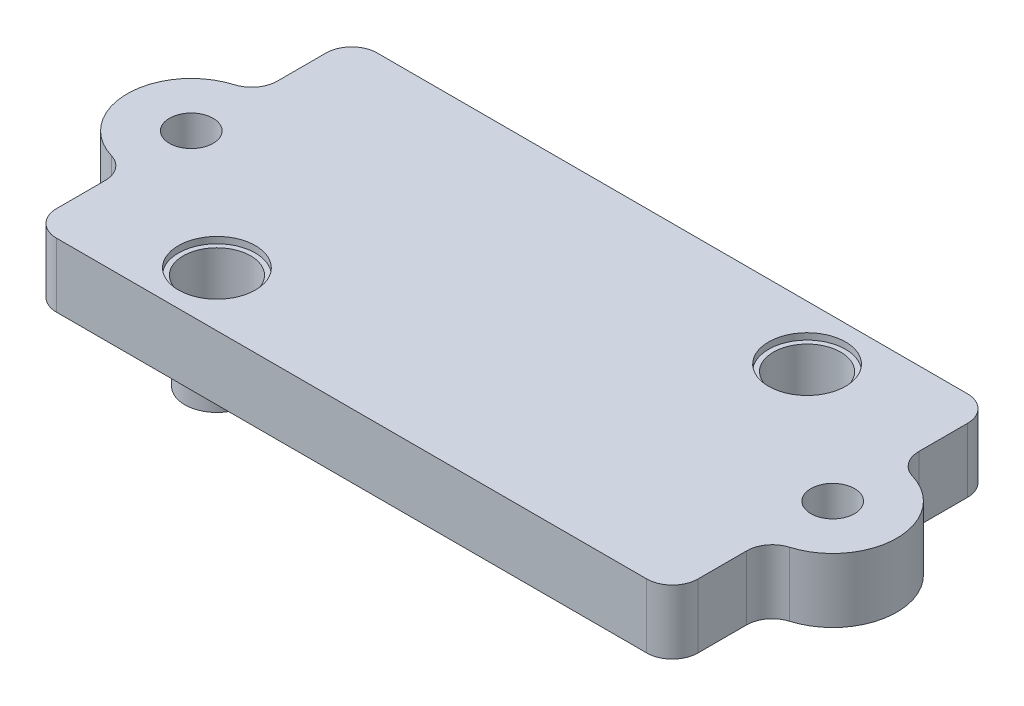
ISO-10303-21;
HEADER;
FILE_DESCRIPTION(('STEP AP214'),'2;1');
FILE_NAME('part.step','',(''),(''),'','','');
FILE_SCHEMA(('AUTOMOTIVE_DESIGN { 1 0 10303 214 1 1 1 1 }'));
ENDSEC;
DATA;
#1=APPLICATION_CONTEXT('core data for automotive mechanical design processes');
#2=APPLICATION_PROTOCOL_DEFINITION('international standard','automotive_design',2000,#1);
#3=PRODUCT_CONTEXT('',#1,'mechanical');
#4=PRODUCT('Part','Part','',(#3));
#5=PRODUCT_RELATED_PRODUCT_CATEGORY('part','',(#4));
#6=PRODUCT_DEFINITION_FORMATION('','',#4);
#7=PRODUCT_DEFINITION_CONTEXT('part definition',#1,'design');
#8=PRODUCT_DEFINITION('design','',#6,#7);
#9=PRODUCT_DEFINITION_SHAPE('','',#8);
#10=(LENGTH_UNIT() NAMED_UNIT(*) SI_UNIT(.MILLI.,.METRE.));
#11=(NAMED_UNIT(*) PLANE_ANGLE_UNIT() SI_UNIT($,.RADIAN.));
#12=(NAMED_UNIT(*) SI_UNIT($,.STERADIAN.) SOLID_ANGLE_UNIT());
#13=UNCERTAINTY_MEASURE_WITH_UNIT(LENGTH_MEASURE(1.E-05),#10,'distance_accuracy_value','');
#14=(GEOMETRIC_REPRESENTATION_CONTEXT(3) GLOBAL_UNCERTAINTY_ASSIGNED_CONTEXT((#13)) GLOBAL_UNIT_ASSIGNED_CONTEXT((#10,
#11,#12)) REPRESENTATION_CONTEXT('',''));
#15=CARTESIAN_POINT('',(0.,0.,0.));
#16=DIRECTION('',(0.,0.,1.));
#17=DIRECTION('',(1.,0.,0.));
#18=AXIS2_PLACEMENT_3D('',#15,#16,#17);
#19=CARTESIAN_POINT('',(0.,0.,0.));
#20=DIRECTION('',(0.,1.,0.));
#21=DIRECTION('',(0.,0.,1.));
#22=AXIS2_PLACEMENT_3D('',#19,#20,#21);
#23=PLANE('',#22);
#24=CARTESIAN_POINT('',(25.,0.,0.));
#25=DIRECTION('',(0.,-1.,0.));
#26=DIRECTION('',(0.,0.,-1.));
#27=AXIS2_PLACEMENT_3D('',#24,#25,#26);
#28=CIRCLE('',#27,3.15);
#29=CARTESIAN_POINT('',(25.,0.,-3.15));
#30=VERTEX_POINT('',#29);
#31=EDGE_CURVE('E303',#30,#30,#28,.T.);
#32=ORIENTED_EDGE('',*,*,#31,.F.);
#33=EDGE_LOOP('',(#32));
#34=FACE_BOUND('',#33,.T.);
#35=CARTESIAN_POINT('',(14.75,0.,-8.25));
#36=DIRECTION('',(0.,1.,0.));
#37=DIRECTION('',(0.,0.,1.));
#38=AXIS2_PLACEMENT_3D('',#35,#36,#37);
#39=CIRCLE('',#38,2.5);
#40=CARTESIAN_POINT('',(14.75,0.,-5.75000000000001));
#41=VERTEX_POINT('',#40);
#42=EDGE_CURVE('E12',#41,#41,#39,.F.);
#43=ORIENTED_EDGE('',*,*,#42,.F.);
#44=EDGE_LOOP('',(#43));
#45=FACE_BOUND('',#44,.T.);
#46=CARTESIAN_POINT('',(-14.75,0.,8.25));
#47=DIRECTION('',(0.,1.,0.));
#48=DIRECTION('',(0.,0.,1.));
#49=AXIS2_PLACEMENT_3D('',#46,#47,#48);
#50=CIRCLE('',#49,2.5);
#51=CARTESIAN_POINT('',(-14.75,0.,10.75));
#52=VERTEX_POINT('',#51);
#53=EDGE_CURVE('E77',#52,#52,#50,.F.);
#54=ORIENTED_EDGE('',*,*,#53,.F.);
#55=EDGE_LOOP('',(#54));
#56=FACE_BOUND('',#55,.T.);
#57=DIRECTION('',(0.,0.,1.));
#58=VECTOR('',#57,1.);
#59=CARTESIAN_POINT('',(25.,0.,0.));
#60=LINE('',#59,#58);
#61=CARTESIAN_POINT('',(25.,0.,6.70820393249937));
#62=VERTEX_POINT('',#61);
#63=CARTESIAN_POINT('',(25.,0.,10.5));
#64=VERTEX_POINT('',#63);
#65=EDGE_CURVE('E188',#62,#64,#60,.T.);
#66=ORIENTED_EDGE('',*,*,#65,.T.);
#67=CARTESIAN_POINT('',(23.,0.,10.5));
#68=DIRECTION('',(0.,1.,0.));
#69=DIRECTION('',(0.,0.,1.));
#70=AXIS2_PLACEMENT_3D('',#67,#68,#69);
#71=CIRCLE('',#70,2.);
#72=CARTESIAN_POINT('',(23.,0.,12.5));
#73=VERTEX_POINT('',#72);
#74=EDGE_CURVE('E226',#64,#73,#71,.F.);
#75=ORIENTED_EDGE('',*,*,#74,.T.);
#76=DIRECTION('',(1.,0.,0.));
#77=VECTOR('',#76,1.);
#78=CARTESIAN_POINT('',(0.,0.,12.5));
#79=LINE('',#78,#77);
#80=CARTESIAN_POINT('',(-23.,0.,12.5));
#81=VERTEX_POINT('',#80);
#82=EDGE_CURVE('E218',#81,#73,#79,.T.);
#83=ORIENTED_EDGE('',*,*,#82,.F.);
#84=CARTESIAN_POINT('',(-23.,0.,10.5));
#85=DIRECTION('',(0.,1.,0.));
#86=DIRECTION('',(0.,0.,1.));
#87=AXIS2_PLACEMENT_3D('',#84,#85,#86);
#88=CIRCLE('',#87,2.);
#89=CARTESIAN_POINT('',(-25.,0.,10.5));
#90=VERTEX_POINT('',#89);
#91=EDGE_CURVE('E224',#81,#90,#88,.F.);
#92=ORIENTED_EDGE('',*,*,#91,.T.);
#93=DIRECTION('',(0.,0.,1.));
#94=VECTOR('',#93,1.);
#95=CARTESIAN_POINT('',(-25.,0.,0.));
#96=LINE('',#95,#94);
#97=CARTESIAN_POINT('',(-25.,0.,6.70820393249938));
#98=VERTEX_POINT('',#97);
#99=EDGE_CURVE('E370',#98,#90,#96,.T.);
#100=ORIENTED_EDGE('',*,*,#99,.F.);
#101=CARTESIAN_POINT('',(-27.,0.,6.70820393249938));
#102=DIRECTION('',(0.,1.,0.));
#103=DIRECTION('',(0.,0.,1.));
#104=AXIS2_PLACEMENT_3D('',#101,#102,#103);
#105=CIRCLE('',#104,2.);
#106=CARTESIAN_POINT('',(-26.4285714285714,0.,4.79157423749956));
#107=VERTEX_POINT('',#106);
#108=EDGE_CURVE('E277',#98,#107,#105,.T.);
#109=ORIENTED_EDGE('',*,*,#108,.T.);
#110=CARTESIAN_POINT('',(-25.,0.,0.));
#111=DIRECTION('',(0.,1.,0.));
#112=DIRECTION('',(0.,0.,1.));
#113=AXIS2_PLACEMENT_3D('',#110,#111,#112);
#114=CIRCLE('',#113,5.);
#115=CARTESIAN_POINT('',(-26.4285714285714,0.,-4.79157423749954));
#116=VERTEX_POINT('',#115);
#117=EDGE_CURVE('E368',#116,#107,#114,.T.);
#118=ORIENTED_EDGE('',*,*,#117,.F.);
#119=CARTESIAN_POINT('',(-27.,0.,-6.70820393249936));
#120=DIRECTION('',(0.,1.,0.));
#121=DIRECTION('',(0.,0.,1.));
#122=AXIS2_PLACEMENT_3D('',#119,#120,#121);
#123=CIRCLE('',#122,2.);
#124=CARTESIAN_POINT('',(-25.,0.,-6.70820393249936));
#125=VERTEX_POINT('',#124);
#126=EDGE_CURVE('E269',#116,#125,#123,.T.);
#127=ORIENTED_EDGE('',*,*,#126,.T.);
#128=DIRECTION('',(0.,0.,1.));
#129=VECTOR('',#128,1.);
#130=CARTESIAN_POINT('',(-25.,0.,0.));
#131=LINE('',#130,#129);
#132=CARTESIAN_POINT('',(-25.,0.,-10.5));
#133=VERTEX_POINT('',#132);
#134=EDGE_CURVE('E365',#133,#125,#131,.T.);
#135=ORIENTED_EDGE('',*,*,#134,.F.);
#136=CARTESIAN_POINT('',(-23.,0.,-10.5));
#137=DIRECTION('',(0.,1.,0.));
#138=DIRECTION('',(0.,0.,1.));
#139=AXIS2_PLACEMENT_3D('',#136,#137,#138);
#140=CIRCLE('',#139,2.);
#141=CARTESIAN_POINT('',(-23.,0.,-12.5));
#142=VERTEX_POINT('',#141);
#143=EDGE_CURVE('E222',#133,#142,#140,.F.);
#144=ORIENTED_EDGE('',*,*,#143,.T.);
#145=DIRECTION('',(1.,0.,0.));
#146=VECTOR('',#145,1.);
#147=CARTESIAN_POINT('',(0.,0.,-12.5));
#148=LINE('',#147,#146);
#149=CARTESIAN_POINT('',(23.,0.,-12.5));
#150=VERTEX_POINT('',#149);
#151=EDGE_CURVE('E362',#142,#150,#148,.T.);
#152=ORIENTED_EDGE('',*,*,#151,.T.);
#153=CARTESIAN_POINT('',(23.,0.,-10.5));
#154=DIRECTION('',(0.,1.,0.));
#155=DIRECTION('',(0.,0.,1.));
#156=AXIS2_PLACEMENT_3D('',#153,#154,#155);
#157=CIRCLE('',#156,2.);
#158=CARTESIAN_POINT('',(25.,0.,-10.5));
#159=VERTEX_POINT('',#158);
#160=EDGE_CURVE('E212',#150,#159,#157,.F.);
#161=ORIENTED_EDGE('',*,*,#160,.T.);
#162=DIRECTION('',(0.,0.,1.));
#163=VECTOR('',#162,1.);
#164=CARTESIAN_POINT('',(25.,0.,0.));
#165=LINE('',#164,#163);
#166=CARTESIAN_POINT('',(25.,0.,-6.70820393249937));
#167=VERTEX_POINT('',#166);
#168=EDGE_CURVE('E359',#159,#167,#165,.T.);
#169=ORIENTED_EDGE('',*,*,#168,.T.);
#170=CARTESIAN_POINT('',(27.,0.,-6.70820393249937));
#171=DIRECTION('',(0.,1.,0.));
#172=DIRECTION('',(0.,0.,1.));
#173=AXIS2_PLACEMENT_3D('',#170,#171,#172);
#174=CIRCLE('',#173,2.);
#175=CARTESIAN_POINT('',(26.4285714285714,0.,-4.79157423749955));
#176=VERTEX_POINT('',#175);
#177=EDGE_CURVE('E273',#167,#176,#174,.T.);
#178=ORIENTED_EDGE('',*,*,#177,.T.);
#179=CARTESIAN_POINT('',(25.,0.,0.));
#180=DIRECTION('',(0.,1.,0.));
#181=DIRECTION('',(0.,0.,1.));
#182=AXIS2_PLACEMENT_3D('',#179,#180,#181);
#183=CIRCLE('',#182,5.);
#184=CARTESIAN_POINT('',(26.4285714285714,0.,4.79157423749955));
#185=VERTEX_POINT('',#184);
#186=EDGE_CURVE('E190',#185,#176,#183,.T.);
#187=ORIENTED_EDGE('',*,*,#186,.F.);
#188=CARTESIAN_POINT('',(27.,0.,6.70820393249937));
#189=DIRECTION('',(0.,1.,0.));
#190=DIRECTION('',(0.,0.,1.));
#191=AXIS2_PLACEMENT_3D('',#188,#189,#190);
#192=CIRCLE('',#191,2.);
#193=EDGE_CURVE('E185',#185,#62,#192,.T.);
#194=ORIENTED_EDGE('',*,*,#193,.T.);
#195=EDGE_LOOP('',(#66,#75,#83,#92,#100,#109,#118,#127,#135,#144,#152,#161,#169,#178,#187,#194));
#196=FACE_BOUND('',#195,.T.);
#197=CARTESIAN_POINT('',(-25.,0.,0.));
#198=DIRECTION('',(0.,-1.,0.));
#199=DIRECTION('',(0.,0.,-1.));
#200=AXIS2_PLACEMENT_3D('',#197,#198,#199);
#201=CIRCLE('',#200,3.15);
#202=CARTESIAN_POINT('',(-25.,0.,-3.14999999999999));
#203=VERTEX_POINT('',#202);
#204=EDGE_CURVE('E283',#203,#203,#201,.T.);
#205=ORIENTED_EDGE('',*,*,#204,.F.);
#206=EDGE_LOOP('',(#205));
#207=FACE_BOUND('',#206,.T.);
#208=ADVANCED_FACE('F68',(#34,#45,#56,#196,#207),#23,.F.);
#209=CARTESIAN_POINT('',(0.,5.,0.));
#210=DIRECTION('',(0.,1.,0.));
#211=DIRECTION('',(0.,0.,1.));
#212=AXIS2_PLACEMENT_3D('',#209,#210,#211);
#213=PLANE('',#212);
#214=CARTESIAN_POINT('',(-25.,5.,0.));
#215=DIRECTION('',(0.,-1.,0.));
#216=DIRECTION('',(0.,0.,-1.));
#217=AXIS2_PLACEMENT_3D('',#214,#215,#216);
#218=CIRCLE('',#217,1.7);
#219=CARTESIAN_POINT('',(-25.,5.,-1.69999999999999));
#220=VERTEX_POINT('',#219);
#221=EDGE_CURVE('E300',#220,#220,#218,.T.);
#222=ORIENTED_EDGE('',*,*,#221,.T.);
#223=EDGE_LOOP('',(#222));
#224=FACE_BOUND('',#223,.T.);
#225=CARTESIAN_POINT('',(25.,5.,0.));
#226=DIRECTION('',(0.,-1.,0.));
#227=DIRECTION('',(0.,0.,-1.));
#228=AXIS2_PLACEMENT_3D('',#225,#226,#227);
#229=CIRCLE('',#228,1.7);
#230=CARTESIAN_POINT('',(25.,5.,-1.7));
#231=VERTEX_POINT('',#230);
#232=EDGE_CURVE('E309',#231,#231,#229,.T.);
#233=ORIENTED_EDGE('',*,*,#232,.T.);
#234=EDGE_LOOP('',(#233));
#235=FACE_BOUND('',#234,.T.);
#236=CARTESIAN_POINT('',(-14.75,5.,8.25));
#237=DIRECTION('',(0.,1.,0.));
#238=DIRECTION('',(0.,0.,1.));
#239=AXIS2_PLACEMENT_3D('',#236,#237,#238);
#240=CIRCLE('',#239,3.);
#241=CARTESIAN_POINT('',(-14.75,5.,11.25));
#242=VERTEX_POINT('',#241);
#243=EDGE_CURVE('E312',#242,#242,#240,.T.);
#244=ORIENTED_EDGE('',*,*,#243,.F.);
#245=EDGE_LOOP('',(#244));
#246=FACE_BOUND('',#245,.T.);
#247=CARTESIAN_POINT('',(14.75,5.,-8.25));
#248=DIRECTION('',(0.,1.,0.));
#249=DIRECTION('',(0.,0.,1.));
#250=AXIS2_PLACEMENT_3D('',#247,#248,#249);
#251=CIRCLE('',#250,3.);
#252=CARTESIAN_POINT('',(14.75,5.,-5.25000000000001));
#253=VERTEX_POINT('',#252);
#254=EDGE_CURVE('E324',#253,#253,#251,.T.);
#255=ORIENTED_EDGE('',*,*,#254,.F.);
#256=EDGE_LOOP('',(#255));
#257=FACE_BOUND('',#256,.T.);
#258=DIRECTION('',(1.,0.,0.));
#259=VECTOR('',#258,1.);
#260=CARTESIAN_POINT('',(0.,5.,12.5));
#261=LINE('',#260,#259);
#262=CARTESIAN_POINT('',(-23.,5.,12.5));
#263=VERTEX_POINT('',#262);
#264=CARTESIAN_POINT('',(23.,5.,12.5));
#265=VERTEX_POINT('',#264);
#266=EDGE_CURVE('E210',#263,#265,#261,.T.);
#267=ORIENTED_EDGE('',*,*,#266,.T.);
#268=CARTESIAN_POINT('',(23.,5.,10.5));
#269=DIRECTION('',(0.,1.,0.));
#270=DIRECTION('',(0.,0.,1.));
#271=AXIS2_PLACEMENT_3D('',#268,#269,#270);
#272=CIRCLE('',#271,2.);
#273=CARTESIAN_POINT('',(25.,5.,10.5));
#274=VERTEX_POINT('',#273);
#275=EDGE_CURVE('E239',#265,#274,#272,.T.);
#276=ORIENTED_EDGE('',*,*,#275,.T.);
#277=DIRECTION('',(0.,0.,1.));
#278=VECTOR('',#277,1.);
#279=CARTESIAN_POINT('',(25.,5.,0.));
#280=LINE('',#279,#278);
#281=CARTESIAN_POINT('',(25.,5.,6.70820393249937));
#282=VERTEX_POINT('',#281);
#283=EDGE_CURVE('E341',#282,#274,#280,.T.);
#284=ORIENTED_EDGE('',*,*,#283,.F.);
#285=CARTESIAN_POINT('',(27.,5.,6.70820393249937));
#286=DIRECTION('',(0.,1.,0.));
#287=DIRECTION('',(0.,0.,1.));
#288=AXIS2_PLACEMENT_3D('',#285,#286,#287);
#289=CIRCLE('',#288,2.);
#290=CARTESIAN_POINT('',(26.4285714285714,5.,4.79157423749955));
#291=VERTEX_POINT('',#290);
#292=EDGE_CURVE('E195',#282,#291,#289,.F.);
#293=ORIENTED_EDGE('',*,*,#292,.T.);
#294=CARTESIAN_POINT('',(25.,5.,0.));
#295=DIRECTION('',(0.,1.,0.));
#296=DIRECTION('',(0.,0.,1.));
#297=AXIS2_PLACEMENT_3D('',#294,#295,#296);
#298=CIRCLE('',#297,5.);
#299=CARTESIAN_POINT('',(26.4285714285714,5.,-4.79157423749955));
#300=VERTEX_POINT('',#299);
#301=EDGE_CURVE('E343',#291,#300,#298,.T.);
#302=ORIENTED_EDGE('',*,*,#301,.T.);
#303=CARTESIAN_POINT('',(27.,5.,-6.70820393249937));
#304=DIRECTION('',(0.,1.,0.));
#305=DIRECTION('',(0.,0.,1.));
#306=AXIS2_PLACEMENT_3D('',#303,#304,#305);
#307=CIRCLE('',#306,2.);
#308=CARTESIAN_POINT('',(25.,5.,-6.70820393249937));
#309=VERTEX_POINT('',#308);
#310=EDGE_CURVE('E196',#300,#309,#307,.F.);
#311=ORIENTED_EDGE('',*,*,#310,.T.);
#312=DIRECTION('',(0.,0.,1.));
#313=VECTOR('',#312,1.);
#314=CARTESIAN_POINT('',(25.,5.,0.));
#315=LINE('',#314,#313);
#316=CARTESIAN_POINT('',(25.,5.,-10.5));
#317=VERTEX_POINT('',#316);
#318=EDGE_CURVE('E346',#317,#309,#315,.T.);
#319=ORIENTED_EDGE('',*,*,#318,.F.);
#320=CARTESIAN_POINT('',(23.,5.,-10.5));
#321=DIRECTION('',(0.,1.,0.));
#322=DIRECTION('',(0.,0.,1.));
#323=AXIS2_PLACEMENT_3D('',#320,#321,#322);
#324=CIRCLE('',#323,2.);
#325=CARTESIAN_POINT('',(23.,5.,-12.5));
#326=VERTEX_POINT('',#325);
#327=EDGE_CURVE('E233',#317,#326,#324,.T.);
#328=ORIENTED_EDGE('',*,*,#327,.T.);
#329=DIRECTION('',(1.,0.,0.));
#330=VECTOR('',#329,1.);
#331=CARTESIAN_POINT('',(0.,5.,-12.5));
#332=LINE('',#331,#330);
#333=CARTESIAN_POINT('',(-23.,5.,-12.5));
#334=VERTEX_POINT('',#333);
#335=EDGE_CURVE('E349',#334,#326,#332,.T.);
#336=ORIENTED_EDGE('',*,*,#335,.F.);
#337=CARTESIAN_POINT('',(-23.,5.,-10.5));
#338=DIRECTION('',(0.,1.,0.));
#339=DIRECTION('',(0.,0.,1.));
#340=AXIS2_PLACEMENT_3D('',#337,#338,#339);
#341=CIRCLE('',#340,2.);
#342=CARTESIAN_POINT('',(-25.,5.,-10.5));
#343=VERTEX_POINT('',#342);
#344=EDGE_CURVE('E235',#334,#343,#341,.T.);
#345=ORIENTED_EDGE('',*,*,#344,.T.);
#346=DIRECTION('',(0.,0.,1.));
#347=VECTOR('',#346,1.);
#348=CARTESIAN_POINT('',(-25.,5.,0.));
#349=LINE('',#348,#347);
#350=CARTESIAN_POINT('',(-25.,5.,-6.70820393249936));
#351=VERTEX_POINT('',#350);
#352=EDGE_CURVE('E352',#343,#351,#349,.T.);
#353=ORIENTED_EDGE('',*,*,#352,.T.);
#354=CARTESIAN_POINT('',(-27.,5.,-6.70820393249936));
#355=DIRECTION('',(0.,1.,0.));
#356=DIRECTION('',(0.,0.,1.));
#357=AXIS2_PLACEMENT_3D('',#354,#355,#356);
#358=CIRCLE('',#357,2.);
#359=CARTESIAN_POINT('',(-26.4285714285714,5.,-4.79157423749954));
#360=VERTEX_POINT('',#359);
#361=EDGE_CURVE('E271',#351,#360,#358,.F.);
#362=ORIENTED_EDGE('',*,*,#361,.T.);
#363=CARTESIAN_POINT('',(-25.,5.,0.));
#364=DIRECTION('',(0.,1.,0.));
#365=DIRECTION('',(0.,0.,1.));
#366=AXIS2_PLACEMENT_3D('',#363,#364,#365);
#367=CIRCLE('',#366,5.);
#368=CARTESIAN_POINT('',(-26.4285714285714,5.,4.79157423749956));
#369=VERTEX_POINT('',#368);
#370=EDGE_CURVE('E355',#360,#369,#367,.T.);
#371=ORIENTED_EDGE('',*,*,#370,.T.);
#372=CARTESIAN_POINT('',(-27.,5.,6.70820393249938));
#373=DIRECTION('',(0.,1.,0.));
#374=DIRECTION('',(0.,0.,1.));
#375=AXIS2_PLACEMENT_3D('',#372,#373,#374);
#376=CIRCLE('',#375,2.);
#377=CARTESIAN_POINT('',(-25.,5.,6.70820393249938));
#378=VERTEX_POINT('',#377);
#379=EDGE_CURVE('E92',#369,#378,#376,.F.);
#380=ORIENTED_EDGE('',*,*,#379,.T.);
#381=DIRECTION('',(0.,0.,1.));
#382=VECTOR('',#381,1.);
#383=CARTESIAN_POINT('',(-25.,5.,0.));
#384=LINE('',#383,#382);
#385=CARTESIAN_POINT('',(-25.,5.,10.5));
#386=VERTEX_POINT('',#385);
#387=EDGE_CURVE('E215',#378,#386,#384,.T.);
#388=ORIENTED_EDGE('',*,*,#387,.T.);
#389=CARTESIAN_POINT('',(-23.,5.,10.5));
#390=DIRECTION('',(0.,1.,0.));
#391=DIRECTION('',(0.,0.,1.));
#392=AXIS2_PLACEMENT_3D('',#389,#390,#391);
#393=CIRCLE('',#392,2.);
#394=EDGE_CURVE('E237',#386,#263,#393,.T.);
#395=ORIENTED_EDGE('',*,*,#394,.T.);
#396=EDGE_LOOP('',(#267,#276,#284,#293,#302,#311,#319,#328,#336,#345,#353,#362,#371,#380,#388,#395));
#397=FACE_BOUND('',#396,.T.);
#398=ADVANCED_FACE('F382',(#224,#235,#246,#257,#397),#213,.T.);
#399=CARTESIAN_POINT('',(25.,5.,0.));
#400=DIRECTION('',(0.,-1.,0.));
#401=DIRECTION('',(0.,0.,-1.));
#402=AXIS2_PLACEMENT_3D('',#399,#400,#401);
#403=CYLINDRICAL_SURFACE('',#402,5.);
#404=ORIENTED_EDGE('',*,*,#186,.T.);
#405=DIRECTION('',(0.,-1.,0.));
#406=VECTOR('',#405,1.);
#407=CARTESIAN_POINT('',(26.4285714285714,5.,-4.79157423749955));
#408=LINE('',#407,#406);
#409=EDGE_CURVE('E267',#176,#300,#408,.F.);
#410=ORIENTED_EDGE('',*,*,#409,.T.);
#411=ORIENTED_EDGE('',*,*,#301,.F.);
#412=DIRECTION('',(0.,-1.,0.));
#413=VECTOR('',#412,1.);
#414=CARTESIAN_POINT('',(26.4285714285714,5.,4.79157423749955));
#415=LINE('',#414,#413);
#416=EDGE_CURVE('E265',#291,#185,#415,.T.);
#417=ORIENTED_EDGE('',*,*,#416,.T.);
#418=EDGE_LOOP('',(#404,#410,#411,#417));
#419=FACE_BOUND('',#418,.T.);
#420=ADVANCED_FACE('F407',(#419),#403,.T.);
#421=CARTESIAN_POINT('',(25.,5.,0.));
#422=DIRECTION('',(1.,0.,0.));
#423=DIRECTION('',(0.,0.,-1.));
#424=AXIS2_PLACEMENT_3D('',#421,#422,#423);
#425=PLANE('',#424);
#426=ORIENTED_EDGE('',*,*,#168,.F.);
#427=DIRECTION('',(0.,-1.,0.));
#428=VECTOR('',#427,1.);
#429=CARTESIAN_POINT('',(25.,5.,-10.5));
#430=LINE('',#429,#428);
#431=EDGE_CURVE('E263',#159,#317,#430,.F.);
#432=ORIENTED_EDGE('',*,*,#431,.T.);
#433=ORIENTED_EDGE('',*,*,#318,.T.);
#434=DIRECTION('',(0.,-1.,0.));
#435=VECTOR('',#434,1.);
#436=CARTESIAN_POINT('',(25.,5.,-6.70820393249937));
#437=LINE('',#436,#435);
#438=EDGE_CURVE('E260',#309,#167,#437,.T.);
#439=ORIENTED_EDGE('',*,*,#438,.T.);
#440=EDGE_LOOP('',(#426,#432,#433,#439));
#441=FACE_BOUND('',#440,.T.);
#442=ADVANCED_FACE('F417',(#441),#425,.T.);
#443=CARTESIAN_POINT('',(0.,5.,-12.5));
#444=DIRECTION('',(0.,0.,-1.));
#445=DIRECTION('',(-1.,0.,0.));
#446=AXIS2_PLACEMENT_3D('',#443,#444,#445);
#447=PLANE('',#446);
#448=ORIENTED_EDGE('',*,*,#151,.F.);
#449=DIRECTION('',(0.,-1.,0.));
#450=VECTOR('',#449,1.);
#451=CARTESIAN_POINT('',(-23.,5.,-12.5));
#452=LINE('',#451,#450);
#453=EDGE_CURVE('E258',#142,#334,#452,.F.);
#454=ORIENTED_EDGE('',*,*,#453,.T.);
#455=ORIENTED_EDGE('',*,*,#335,.T.);
#456=DIRECTION('',(0.,-1.,0.));
#457=VECTOR('',#456,1.);
#458=CARTESIAN_POINT('',(23.,5.,-12.5));
#459=LINE('',#458,#457);
#460=EDGE_CURVE('E255',#326,#150,#459,.T.);
#461=ORIENTED_EDGE('',*,*,#460,.T.);
#462=EDGE_LOOP('',(#448,#454,#455,#461));
#463=FACE_BOUND('',#462,.T.);
#464=ADVANCED_FACE('F423',(#463),#447,.T.);
#465=CARTESIAN_POINT('',(-25.,5.,0.));
#466=DIRECTION('',(1.,0.,0.));
#467=DIRECTION('',(0.,0.,-1.));
#468=AXIS2_PLACEMENT_3D('',#465,#466,#467);
#469=PLANE('',#468);
#470=ORIENTED_EDGE('',*,*,#134,.T.);
#471=DIRECTION('',(0.,1.,0.));
#472=VECTOR('',#471,1.);
#473=CARTESIAN_POINT('',(-25.,5.,-6.70820393249936));
#474=LINE('',#473,#472);
#475=EDGE_CURVE('E253',#125,#351,#474,.T.);
#476=ORIENTED_EDGE('',*,*,#475,.T.);
#477=ORIENTED_EDGE('',*,*,#352,.F.);
#478=DIRECTION('',(0.,-1.,0.));
#479=VECTOR('',#478,1.);
#480=CARTESIAN_POINT('',(-25.,0.,-10.5));
#481=LINE('',#480,#479);
#482=EDGE_CURVE('E250',#343,#133,#481,.T.);
#483=ORIENTED_EDGE('',*,*,#482,.T.);
#484=EDGE_LOOP('',(#470,#476,#477,#483));
#485=FACE_BOUND('',#484,.T.);
#486=ADVANCED_FACE('F402',(#485),#469,.F.);
#487=CARTESIAN_POINT('',(-25.,5.,0.));
#488=DIRECTION('',(0.,-1.,0.));
#489=DIRECTION('',(0.,0.,-1.));
#490=AXIS2_PLACEMENT_3D('',#487,#488,#489);
#491=CYLINDRICAL_SURFACE('',#490,5.);
#492=ORIENTED_EDGE('',*,*,#370,.F.);
#493=DIRECTION('',(0.,-1.,0.));
#494=VECTOR('',#493,1.);
#495=CARTESIAN_POINT('',(-26.4285714285714,5.,-4.79157423749954));
#496=LINE('',#495,#494);
#497=EDGE_CURVE('E247',#360,#116,#496,.T.);
#498=ORIENTED_EDGE('',*,*,#497,.T.);
#499=ORIENTED_EDGE('',*,*,#117,.T.);
#500=DIRECTION('',(0.,-1.,0.));
#501=VECTOR('',#500,1.);
#502=CARTESIAN_POINT('',(-26.4285714285714,5.,4.79157423749956));
#503=LINE('',#502,#501);
#504=EDGE_CURVE('E245',#107,#369,#503,.F.);
#505=ORIENTED_EDGE('',*,*,#504,.T.);
#506=EDGE_LOOP('',(#492,#498,#499,#505));
#507=FACE_BOUND('',#506,.T.);
#508=ADVANCED_FACE('F392',(#507),#491,.T.);
#509=CARTESIAN_POINT('',(-25.,5.,0.));
#510=DIRECTION('',(1.,0.,0.));
#511=DIRECTION('',(0.,0.,-1.));
#512=AXIS2_PLACEMENT_3D('',#509,#510,#511);
#513=PLANE('',#512);
#514=ORIENTED_EDGE('',*,*,#99,.T.);
#515=DIRECTION('',(0.,-1.,0.));
#516=VECTOR('',#515,1.);
#517=CARTESIAN_POINT('',(-25.,5.,10.5));
#518=LINE('',#517,#516);
#519=EDGE_CURVE('E85',#90,#386,#518,.F.);
#520=ORIENTED_EDGE('',*,*,#519,.T.);
#521=ORIENTED_EDGE('',*,*,#387,.F.);
#522=DIRECTION('',(0.,1.,0.));
#523=VECTOR('',#522,1.);
#524=CARTESIAN_POINT('',(-25.,0.,6.70820393249938));
#525=LINE('',#524,#523);
#526=EDGE_CURVE('E241',#378,#98,#525,.F.);
#527=ORIENTED_EDGE('',*,*,#526,.T.);
#528=EDGE_LOOP('',(#514,#520,#521,#527));
#529=FACE_BOUND('',#528,.T.);
#530=ADVANCED_FACE('F394',(#529),#513,.F.);
#531=CARTESIAN_POINT('',(0.,5.,12.5));
#532=DIRECTION('',(0.,0.,-1.));
#533=DIRECTION('',(-1.,0.,0.));
#534=AXIS2_PLACEMENT_3D('',#531,#532,#533);
#535=PLANE('',#534);
#536=ORIENTED_EDGE('',*,*,#82,.T.);
#537=DIRECTION('',(0.,-1.,0.));
#538=VECTOR('',#537,1.);
#539=CARTESIAN_POINT('',(23.,5.,12.5));
#540=LINE('',#539,#538);
#541=EDGE_CURVE('E231',#73,#265,#540,.F.);
#542=ORIENTED_EDGE('',*,*,#541,.T.);
#543=ORIENTED_EDGE('',*,*,#266,.F.);
#544=DIRECTION('',(0.,-1.,0.));
#545=VECTOR('',#544,1.);
#546=CARTESIAN_POINT('',(-23.,5.,12.5));
#547=LINE('',#546,#545);
#548=EDGE_CURVE('E228',#263,#81,#547,.T.);
#549=ORIENTED_EDGE('',*,*,#548,.T.);
#550=EDGE_LOOP('',(#536,#542,#543,#549));
#551=FACE_BOUND('',#550,.T.);
#552=ADVANCED_FACE('F376',(#551),#535,.F.);
#553=CARTESIAN_POINT('',(25.,5.,0.));
#554=DIRECTION('',(1.,0.,0.));
#555=DIRECTION('',(0.,0.,-1.));
#556=AXIS2_PLACEMENT_3D('',#553,#554,#555);
#557=PLANE('',#556);
#558=ORIENTED_EDGE('',*,*,#283,.T.);
#559=DIRECTION('',(0.,-1.,0.));
#560=VECTOR('',#559,1.);
#561=CARTESIAN_POINT('',(25.,0.,10.5));
#562=LINE('',#561,#560);
#563=EDGE_CURVE('E205',#274,#64,#562,.T.);
#564=ORIENTED_EDGE('',*,*,#563,.T.);
#565=ORIENTED_EDGE('',*,*,#65,.F.);
#566=DIRECTION('',(0.,-1.,0.));
#567=VECTOR('',#566,1.);
#568=CARTESIAN_POINT('',(25.,5.,6.70820393249937));
#569=LINE('',#568,#567);
#570=EDGE_CURVE('E202',#62,#282,#569,.F.);
#571=ORIENTED_EDGE('',*,*,#570,.T.);
#572=EDGE_LOOP('',(#558,#564,#565,#571));
#573=FACE_BOUND('',#572,.T.);
#574=ADVANCED_FACE('F201',(#573),#557,.T.);
#575=CARTESIAN_POINT('',(23.,5.,10.5));
#576=DIRECTION('',(0.,1.,0.));
#577=DIRECTION('',(0.,0.,1.));
#578=AXIS2_PLACEMENT_3D('',#575,#576,#577);
#579=CYLINDRICAL_SURFACE('',#578,2.);
#580=ORIENTED_EDGE('',*,*,#275,.F.);
#581=ORIENTED_EDGE('',*,*,#541,.F.);
#582=ORIENTED_EDGE('',*,*,#74,.F.);
#583=ORIENTED_EDGE('',*,*,#563,.F.);
#584=EDGE_LOOP('',(#580,#581,#582,#583));
#585=FACE_BOUND('',#584,.T.);
#586=ADVANCED_FACE('F381',(#585),#579,.T.);
#587=CARTESIAN_POINT('',(-23.,5.,10.5));
#588=DIRECTION('',(0.,-1.,0.));
#589=DIRECTION('',(0.,0.,-1.));
#590=AXIS2_PLACEMENT_3D('',#587,#588,#589);
#591=CYLINDRICAL_SURFACE('',#590,2.);
#592=ORIENTED_EDGE('',*,*,#394,.F.);
#593=ORIENTED_EDGE('',*,*,#519,.F.);
#594=ORIENTED_EDGE('',*,*,#91,.F.);
#595=ORIENTED_EDGE('',*,*,#548,.F.);
#596=EDGE_LOOP('',(#592,#593,#594,#595));
#597=FACE_BOUND('',#596,.T.);
#598=ADVANCED_FACE('F385',(#597),#591,.T.);
#599=CARTESIAN_POINT('',(-27.,5.,-6.70820393249936));
#600=DIRECTION('',(0.,-1.,0.));
#601=DIRECTION('',(0.,0.,-1.));
#602=AXIS2_PLACEMENT_3D('',#599,#600,#601);
#603=CYLINDRICAL_SURFACE('',#602,2.);
#604=ORIENTED_EDGE('',*,*,#361,.F.);
#605=ORIENTED_EDGE('',*,*,#475,.F.);
#606=ORIENTED_EDGE('',*,*,#126,.F.);
#607=ORIENTED_EDGE('',*,*,#497,.F.);
#608=EDGE_LOOP('',(#604,#605,#606,#607));
#609=FACE_BOUND('',#608,.T.);
#610=ADVANCED_FACE('F434',(#609),#603,.F.);
#611=CARTESIAN_POINT('',(-23.,5.,-10.5));
#612=DIRECTION('',(0.,1.,0.));
#613=DIRECTION('',(0.,0.,1.));
#614=AXIS2_PLACEMENT_3D('',#611,#612,#613);
#615=CYLINDRICAL_SURFACE('',#614,2.);
#616=ORIENTED_EDGE('',*,*,#344,.F.);
#617=ORIENTED_EDGE('',*,*,#453,.F.);
#618=ORIENTED_EDGE('',*,*,#143,.F.);
#619=ORIENTED_EDGE('',*,*,#482,.F.);
#620=EDGE_LOOP('',(#616,#617,#618,#619));
#621=FACE_BOUND('',#620,.T.);
#622=ADVANCED_FACE('F437',(#621),#615,.T.);
#623=CARTESIAN_POINT('',(23.,5.,-10.5));
#624=DIRECTION('',(0.,-1.,0.));
#625=DIRECTION('',(0.,0.,-1.));
#626=AXIS2_PLACEMENT_3D('',#623,#624,#625);
#627=CYLINDRICAL_SURFACE('',#626,2.);
#628=ORIENTED_EDGE('',*,*,#327,.F.);
#629=ORIENTED_EDGE('',*,*,#431,.F.);
#630=ORIENTED_EDGE('',*,*,#160,.F.);
#631=ORIENTED_EDGE('',*,*,#460,.F.);
#632=EDGE_LOOP('',(#628,#629,#630,#631));
#633=FACE_BOUND('',#632,.T.);
#634=ADVANCED_FACE('F441',(#633),#627,.T.);
#635=CARTESIAN_POINT('',(27.,5.,-6.70820393249937));
#636=DIRECTION('',(0.,-1.,0.));
#637=DIRECTION('',(0.,0.,-1.));
#638=AXIS2_PLACEMENT_3D('',#635,#636,#637);
#639=CYLINDRICAL_SURFACE('',#638,2.);
#640=ORIENTED_EDGE('',*,*,#310,.F.);
#641=ORIENTED_EDGE('',*,*,#409,.F.);
#642=ORIENTED_EDGE('',*,*,#177,.F.);
#643=ORIENTED_EDGE('',*,*,#438,.F.);
#644=EDGE_LOOP('',(#640,#641,#642,#643));
#645=FACE_BOUND('',#644,.T.);
#646=ADVANCED_FACE('F445',(#645),#639,.F.);
#647=CARTESIAN_POINT('',(27.,5.,6.70820393249937));
#648=DIRECTION('',(0.,-1.,0.));
#649=DIRECTION('',(0.,0.,-1.));
#650=AXIS2_PLACEMENT_3D('',#647,#648,#649);
#651=CYLINDRICAL_SURFACE('',#650,2.);
#652=ORIENTED_EDGE('',*,*,#292,.F.);
#653=ORIENTED_EDGE('',*,*,#570,.F.);
#654=ORIENTED_EDGE('',*,*,#193,.F.);
#655=ORIENTED_EDGE('',*,*,#416,.F.);
#656=EDGE_LOOP('',(#652,#653,#654,#655));
#657=FACE_BOUND('',#656,.T.);
#658=ADVANCED_FACE('F209',(#657),#651,.F.);
#659=CARTESIAN_POINT('',(-27.,5.,6.70820393249938));
#660=DIRECTION('',(0.,-1.,0.));
#661=DIRECTION('',(0.,0.,-1.));
#662=AXIS2_PLACEMENT_3D('',#659,#660,#661);
#663=CYLINDRICAL_SURFACE('',#662,2.);
#664=ORIENTED_EDGE('',*,*,#379,.F.);
#665=ORIENTED_EDGE('',*,*,#504,.F.);
#666=ORIENTED_EDGE('',*,*,#108,.F.);
#667=ORIENTED_EDGE('',*,*,#526,.F.);
#668=EDGE_LOOP('',(#664,#665,#666,#667));
#669=FACE_BOUND('',#668,.T.);
#670=ADVANCED_FACE('F70',(#669),#663,.F.);
#671=CARTESIAN_POINT('',(-14.75,-3.,8.25));
#672=DIRECTION('',(0.,1.,0.));
#673=DIRECTION('',(0.,0.,1.));
#674=AXIS2_PLACEMENT_3D('',#671,#672,#673);
#675=CYLINDRICAL_SURFACE('',#674,2.5);
#676=CARTESIAN_POINT('',(-14.75,-3.,8.25));
#677=DIRECTION('',(0.,-1.,0.));
#678=DIRECTION('',(0.,0.,-1.));
#679=AXIS2_PLACEMENT_3D('',#676,#677,#678);
#680=CIRCLE('',#679,2.5);
#681=CARTESIAN_POINT('',(-14.75,-3.,5.75));
#682=VERTEX_POINT('',#681);
#683=EDGE_CURVE('E206',#682,#682,#680,.T.);
#684=ORIENTED_EDGE('',*,*,#683,.F.);
#685=EDGE_LOOP('',(#684));
#686=FACE_BOUND('',#685,.T.);
#687=ORIENTED_EDGE('',*,*,#53,.T.);
#688=EDGE_LOOP('',(#687));
#689=FACE_BOUND('',#688,.T.);
#690=ADVANCED_FACE('F453',(#686,#689),#675,.T.);
#691=CARTESIAN_POINT('',(-14.75,-3.,8.25));
#692=DIRECTION('',(0.,-1.,0.));
#693=DIRECTION('',(0.,0.,-1.));
#694=AXIS2_PLACEMENT_3D('',#691,#692,#693);
#695=PLANE('',#694);
#696=CARTESIAN_POINT('',(-14.75,-3.,8.25));
#697=DIRECTION('',(0.,-1.,0.));
#698=DIRECTION('',(0.,0.,-1.));
#699=AXIS2_PLACEMENT_3D('',#696,#697,#698);
#700=CIRCLE('',#699,1.625);
#701=CARTESIAN_POINT('',(-14.75,-3.,6.625));
#702=VERTEX_POINT('',#701);
#703=EDGE_CURVE('E295',#702,#702,#700,.T.);
#704=ORIENTED_EDGE('',*,*,#703,.F.);
#705=EDGE_LOOP('',(#704));
#706=FACE_BOUND('',#705,.T.);
#707=ORIENTED_EDGE('',*,*,#683,.T.);
#708=EDGE_LOOP('',(#707));
#709=FACE_BOUND('',#708,.T.);
#710=ADVANCED_FACE('F457',(#706,#709),#695,.T.);
#711=CARTESIAN_POINT('',(14.75,-3.,-8.25));
#712=DIRECTION('',(0.,1.,0.));
#713=DIRECTION('',(0.,0.,1.));
#714=AXIS2_PLACEMENT_3D('',#711,#712,#713);
#715=CYLINDRICAL_SURFACE('',#714,2.5);
#716=CARTESIAN_POINT('',(14.75,-3.,-8.25));
#717=DIRECTION('',(0.,-1.,0.));
#718=DIRECTION('',(0.,0.,-1.));
#719=AXIS2_PLACEMENT_3D('',#716,#717,#718);
#720=CIRCLE('',#719,2.5);
#721=CARTESIAN_POINT('',(14.75,-3.,-10.75));
#722=VERTEX_POINT('',#721);
#723=EDGE_CURVE('E336',#722,#722,#720,.T.);
#724=ORIENTED_EDGE('',*,*,#723,.F.);
#725=EDGE_LOOP('',(#724));
#726=FACE_BOUND('',#725,.T.);
#727=ORIENTED_EDGE('',*,*,#42,.T.);
#728=EDGE_LOOP('',(#727));
#729=FACE_BOUND('',#728,.T.);
#730=ADVANCED_FACE('F464',(#726,#729),#715,.T.);
#731=CARTESIAN_POINT('',(14.75,-3.,-8.25));
#732=DIRECTION('',(0.,-1.,0.));
#733=DIRECTION('',(0.,0.,-1.));
#734=AXIS2_PLACEMENT_3D('',#731,#732,#733);
#735=PLANE('',#734);
#736=CARTESIAN_POINT('',(14.75,-3.,-8.25));
#737=DIRECTION('',(0.,-1.,0.));
#738=DIRECTION('',(0.,0.,-1.));
#739=AXIS2_PLACEMENT_3D('',#736,#737,#738);
#740=CIRCLE('',#739,1.625);
#741=CARTESIAN_POINT('',(14.75,-3.,-9.87500000000001));
#742=VERTEX_POINT('',#741);
#743=EDGE_CURVE('E284',#742,#742,#740,.T.);
#744=ORIENTED_EDGE('',*,*,#743,.F.);
#745=EDGE_LOOP('',(#744));
#746=FACE_BOUND('',#745,.T.);
#747=ORIENTED_EDGE('',*,*,#723,.T.);
#748=EDGE_LOOP('',(#747));
#749=FACE_BOUND('',#748,.T.);
#750=ADVANCED_FACE('F470',(#746,#749),#735,.T.);
#751=CARTESIAN_POINT('',(14.75,1.,-8.25));
#752=DIRECTION('',(0.,1.,0.));
#753=DIRECTION('',(0.,0.,1.));
#754=AXIS2_PLACEMENT_3D('',#751,#752,#753);
#755=CONICAL_SURFACE('',#754,2.625,1.02974425867665);
#756=CARTESIAN_POINT('',(14.75,0.399139380972439,-8.25));
#757=DIRECTION('',(0.,1.,0.));
#758=DIRECTION('',(0.,0.,1.));
#759=AXIS2_PLACEMENT_3D('',#756,#757,#758);
#760=CIRCLE('',#759,1.625);
#761=CARTESIAN_POINT('',(14.75,0.399139380972439,-6.625));
#762=VERTEX_POINT('',#761);
#763=EDGE_CURVE('E281',#762,#762,#760,.F.);
#764=ORIENTED_EDGE('',*,*,#763,.T.);
#765=EDGE_LOOP('',(#764));
#766=FACE_BOUND('',#765,.T.);
#767=CARTESIAN_POINT('',(14.75,1.,-8.25));
#768=DIRECTION('',(0.,1.,0.));
#769=DIRECTION('',(0.,0.,1.));
#770=AXIS2_PLACEMENT_3D('',#767,#768,#769);
#771=CIRCLE('',#770,2.625);
#772=CARTESIAN_POINT('',(14.75,1.,-5.62500000000001));
#773=VERTEX_POINT('',#772);
#774=EDGE_CURVE('E333',#773,#773,#771,.T.);
#775=ORIENTED_EDGE('',*,*,#774,.T.);
#776=EDGE_LOOP('',(#775));
#777=FACE_BOUND('',#776,.T.);
#778=ADVANCED_FACE('F473',(#766,#777),#755,.F.);
#779=CARTESIAN_POINT('',(14.75,5.,-8.25));
#780=DIRECTION('',(0.,1.,0.));
#781=DIRECTION('',(0.,0.,1.));
#782=AXIS2_PLACEMENT_3D('',#779,#780,#781);
#783=CYLINDRICAL_SURFACE('',#782,2.625);
#784=ORIENTED_EDGE('',*,*,#774,.F.);
#785=EDGE_LOOP('',(#784));
#786=FACE_BOUND('',#785,.T.);
#787=CARTESIAN_POINT('',(14.75,4.5,-8.25));
#788=DIRECTION('',(0.,1.,0.));
#789=DIRECTION('',(0.,0.,1.));
#790=AXIS2_PLACEMENT_3D('',#787,#788,#789);
#791=CIRCLE('',#790,2.625);
#792=CARTESIAN_POINT('',(14.75,4.5,-5.62500000000001));
#793=VERTEX_POINT('',#792);
#794=EDGE_CURVE('E330',#793,#793,#791,.T.);
#795=ORIENTED_EDGE('',*,*,#794,.T.);
#796=EDGE_LOOP('',(#795));
#797=FACE_BOUND('',#796,.T.);
#798=ADVANCED_FACE('F479',(#786,#797),#783,.F.);
#799=CARTESIAN_POINT('',(17.375,4.5,-8.25));
#800=DIRECTION('',(0.,-1.,0.));
#801=DIRECTION('',(0.,0.,-1.));
#802=AXIS2_PLACEMENT_3D('',#799,#800,#801);
#803=PLANE('',#802);
#804=ORIENTED_EDGE('',*,*,#794,.F.);
#805=EDGE_LOOP('',(#804));
#806=FACE_BOUND('',#805,.T.);
#807=CARTESIAN_POINT('',(14.75,4.5,-8.25));
#808=DIRECTION('',(0.,1.,0.));
#809=DIRECTION('',(0.,0.,1.));
#810=AXIS2_PLACEMENT_3D('',#807,#808,#809);
#811=CIRCLE('',#810,3.);
#812=CARTESIAN_POINT('',(14.75,4.5,-5.25000000000001));
#813=VERTEX_POINT('',#812);
#814=EDGE_CURVE('E327',#813,#813,#811,.T.);
#815=ORIENTED_EDGE('',*,*,#814,.T.);
#816=EDGE_LOOP('',(#815));
#817=FACE_BOUND('',#816,.T.);
#818=ADVANCED_FACE('F482',(#806,#817),#803,.F.);
#819=CARTESIAN_POINT('',(14.75,5.,-8.25));
#820=DIRECTION('',(0.,1.,0.));
#821=DIRECTION('',(0.,0.,1.));
#822=AXIS2_PLACEMENT_3D('',#819,#820,#821);
#823=CYLINDRICAL_SURFACE('',#822,3.);
#824=ORIENTED_EDGE('',*,*,#814,.F.);
#825=EDGE_LOOP('',(#824));
#826=FACE_BOUND('',#825,.T.);
#827=ORIENTED_EDGE('',*,*,#254,.T.);
#828=EDGE_LOOP('',(#827));
#829=FACE_BOUND('',#828,.T.);
#830=ADVANCED_FACE('F486',(#826,#829),#823,.F.);
#831=CARTESIAN_POINT('',(-14.75,1.,8.25));
#832=DIRECTION('',(0.,1.,0.));
#833=DIRECTION('',(0.,0.,1.));
#834=AXIS2_PLACEMENT_3D('',#831,#832,#833);
#835=CONICAL_SURFACE('',#834,2.625,1.02974425867665);
#836=CARTESIAN_POINT('',(-14.75,0.399139380972439,8.25));
#837=DIRECTION('',(0.,1.,0.));
#838=DIRECTION('',(0.,0.,1.));
#839=AXIS2_PLACEMENT_3D('',#836,#837,#838);
#840=CIRCLE('',#839,1.625);
#841=CARTESIAN_POINT('',(-14.75,0.399139380972439,9.875));
#842=VERTEX_POINT('',#841);
#843=EDGE_CURVE('E72',#842,#842,#840,.F.);
#844=ORIENTED_EDGE('',*,*,#843,.T.);
#845=EDGE_LOOP('',(#844));
#846=FACE_BOUND('',#845,.T.);
#847=CARTESIAN_POINT('',(-14.75,1.,8.25));
#848=DIRECTION('',(0.,1.,0.));
#849=DIRECTION('',(0.,0.,1.));
#850=AXIS2_PLACEMENT_3D('',#847,#848,#849);
#851=CIRCLE('',#850,2.625);
#852=CARTESIAN_POINT('',(-14.75,1.,10.875));
#853=VERTEX_POINT('',#852);
#854=EDGE_CURVE('E321',#853,#853,#851,.T.);
#855=ORIENTED_EDGE('',*,*,#854,.T.);
#856=EDGE_LOOP('',(#855));
#857=FACE_BOUND('',#856,.T.);
#858=ADVANCED_FACE('F490',(#846,#857),#835,.F.);
#859=CARTESIAN_POINT('',(-14.75,5.,8.25));
#860=DIRECTION('',(0.,1.,0.));
#861=DIRECTION('',(0.,0.,1.));
#862=AXIS2_PLACEMENT_3D('',#859,#860,#861);
#863=CYLINDRICAL_SURFACE('',#862,2.625);
#864=ORIENTED_EDGE('',*,*,#854,.F.);
#865=EDGE_LOOP('',(#864));
#866=FACE_BOUND('',#865,.T.);
#867=CARTESIAN_POINT('',(-14.75,4.5,8.25));
#868=DIRECTION('',(0.,1.,0.));
#869=DIRECTION('',(0.,0.,1.));
#870=AXIS2_PLACEMENT_3D('',#867,#868,#869);
#871=CIRCLE('',#870,2.625);
#872=CARTESIAN_POINT('',(-14.75,4.5,10.875));
#873=VERTEX_POINT('',#872);
#874=EDGE_CURVE('E318',#873,#873,#871,.T.);
#875=ORIENTED_EDGE('',*,*,#874,.T.);
#876=EDGE_LOOP('',(#875));
#877=FACE_BOUND('',#876,.T.);
#878=ADVANCED_FACE('F494',(#866,#877),#863,.F.);
#879=CARTESIAN_POINT('',(-12.125,4.5,8.25));
#880=DIRECTION('',(0.,-1.,0.));
#881=DIRECTION('',(0.,0.,-1.));
#882=AXIS2_PLACEMENT_3D('',#879,#880,#881);
#883=PLANE('',#882);
#884=ORIENTED_EDGE('',*,*,#874,.F.);
#885=EDGE_LOOP('',(#884));
#886=FACE_BOUND('',#885,.T.);
#887=CARTESIAN_POINT('',(-14.75,4.5,8.25));
#888=DIRECTION('',(0.,1.,0.));
#889=DIRECTION('',(0.,0.,1.));
#890=AXIS2_PLACEMENT_3D('',#887,#888,#889);
#891=CIRCLE('',#890,3.);
#892=CARTESIAN_POINT('',(-14.75,4.5,11.25));
#893=VERTEX_POINT('',#892);
#894=EDGE_CURVE('E315',#893,#893,#891,.T.);
#895=ORIENTED_EDGE('',*,*,#894,.T.);
#896=EDGE_LOOP('',(#895));
#897=FACE_BOUND('',#896,.T.);
#898=ADVANCED_FACE('F498',(#886,#897),#883,.F.);
#899=CARTESIAN_POINT('',(-14.75,5.,8.25));
#900=DIRECTION('',(0.,1.,0.));
#901=DIRECTION('',(0.,0.,1.));
#902=AXIS2_PLACEMENT_3D('',#899,#900,#901);
#903=CYLINDRICAL_SURFACE('',#902,3.);
#904=ORIENTED_EDGE('',*,*,#894,.F.);
#905=EDGE_LOOP('',(#904));
#906=FACE_BOUND('',#905,.T.);
#907=ORIENTED_EDGE('',*,*,#243,.T.);
#908=EDGE_LOOP('',(#907));
#909=FACE_BOUND('',#908,.T.);
#910=ADVANCED_FACE('F502',(#906,#909),#903,.F.);
#911=CARTESIAN_POINT('',(25.,0.,0.));
#912=DIRECTION('',(0.,-1.,0.));
#913=DIRECTION('',(0.,0.,-1.));
#914=AXIS2_PLACEMENT_3D('',#911,#912,#913);
#915=CYLINDRICAL_SURFACE('',#914,1.7);
#916=ORIENTED_EDGE('',*,*,#232,.F.);
#917=EDGE_LOOP('',(#916));
#918=FACE_BOUND('',#917,.T.);
#919=CARTESIAN_POINT('',(25.,1.45,0.));
#920=DIRECTION('',(0.,-1.,0.));
#921=DIRECTION('',(0.,0.,-1.));
#922=AXIS2_PLACEMENT_3D('',#919,#920,#921);
#923=CIRCLE('',#922,1.7);
#924=CARTESIAN_POINT('',(25.,1.45,-1.7));
#925=VERTEX_POINT('',#924);
#926=EDGE_CURVE('E306',#925,#925,#923,.T.);
#927=ORIENTED_EDGE('',*,*,#926,.T.);
#928=EDGE_LOOP('',(#927));
#929=FACE_BOUND('',#928,.T.);
#930=ADVANCED_FACE('F505',(#918,#929),#915,.F.);
#931=CARTESIAN_POINT('',(25.,0.,0.));
#932=DIRECTION('',(0.,-1.,0.));
#933=DIRECTION('',(0.,0.,-1.));
#934=AXIS2_PLACEMENT_3D('',#931,#932,#933);
#935=CONICAL_SURFACE('',#934,3.15,0.785398163397448);
#936=ORIENTED_EDGE('',*,*,#926,.F.);
#937=EDGE_LOOP('',(#936));
#938=FACE_BOUND('',#937,.T.);
#939=ORIENTED_EDGE('',*,*,#31,.T.);
#940=EDGE_LOOP('',(#939));
#941=FACE_BOUND('',#940,.T.);
#942=ADVANCED_FACE('F509',(#938,#941),#935,.F.);
#943=CARTESIAN_POINT('',(-25.,0.,0.));
#944=DIRECTION('',(0.,-1.,0.));
#945=DIRECTION('',(0.,0.,-1.));
#946=AXIS2_PLACEMENT_3D('',#943,#944,#945);
#947=CYLINDRICAL_SURFACE('',#946,1.7);
#948=ORIENTED_EDGE('',*,*,#221,.F.);
#949=EDGE_LOOP('',(#948));
#950=FACE_BOUND('',#949,.T.);
#951=CARTESIAN_POINT('',(-25.,1.45,0.));
#952=DIRECTION('',(0.,-1.,0.));
#953=DIRECTION('',(0.,0.,-1.));
#954=AXIS2_PLACEMENT_3D('',#951,#952,#953);
#955=CIRCLE('',#954,1.7);
#956=CARTESIAN_POINT('',(-25.,1.45,-1.69999999999999));
#957=VERTEX_POINT('',#956);
#958=EDGE_CURVE('E288',#957,#957,#955,.T.);
#959=ORIENTED_EDGE('',*,*,#958,.T.);
#960=EDGE_LOOP('',(#959));
#961=FACE_BOUND('',#960,.T.);
#962=ADVANCED_FACE('F513',(#950,#961),#947,.F.);
#963=CARTESIAN_POINT('',(-25.,0.,0.));
#964=DIRECTION('',(0.,-1.,0.));
#965=DIRECTION('',(0.,0.,-1.));
#966=AXIS2_PLACEMENT_3D('',#963,#964,#965);
#967=CONICAL_SURFACE('',#966,3.15,0.785398163397448);
#968=ORIENTED_EDGE('',*,*,#958,.F.);
#969=EDGE_LOOP('',(#968));
#970=FACE_BOUND('',#969,.T.);
#971=ORIENTED_EDGE('',*,*,#204,.T.);
#972=EDGE_LOOP('',(#971));
#973=FACE_BOUND('',#972,.T.);
#974=ADVANCED_FACE('F517',(#970,#973),#967,.F.);
#975=CARTESIAN_POINT('',(14.75,-3.,-8.25));
#976=DIRECTION('',(0.,-1.,0.));
#977=DIRECTION('',(0.,0.,-1.));
#978=AXIS2_PLACEMENT_3D('',#975,#976,#977);
#979=CYLINDRICAL_SURFACE('',#978,1.625);
#980=ORIENTED_EDGE('',*,*,#743,.T.);
#981=EDGE_LOOP('',(#980));
#982=FACE_BOUND('',#981,.T.);
#983=ORIENTED_EDGE('',*,*,#763,.F.);
#984=EDGE_LOOP('',(#983));
#985=FACE_BOUND('',#984,.T.);
#986=ADVANCED_FACE('F521',(#982,#985),#979,.F.);
#987=CARTESIAN_POINT('',(-14.75,-3.,8.25));
#988=DIRECTION('',(0.,-1.,0.));
#989=DIRECTION('',(0.,0.,-1.));
#990=AXIS2_PLACEMENT_3D('',#987,#988,#989);
#991=CYLINDRICAL_SURFACE('',#990,1.625);
#992=ORIENTED_EDGE('',*,*,#703,.T.);
#993=EDGE_LOOP('',(#992));
#994=FACE_BOUND('',#993,.T.);
#995=ORIENTED_EDGE('',*,*,#843,.F.);
#996=EDGE_LOOP('',(#995));
#997=FACE_BOUND('',#996,.T.);
#998=ADVANCED_FACE('F525',(#994,#997),#991,.F.);
#999=CLOSED_SHELL('',(#208,#398,#420,#442,#464,#486,#508,#530,#552,#574,#586,#598,#610,#622,
#634,#646,#658,#670,#690,#710,#730,#750,#778,#798,#818,#830,#858,#878,#898,#910,#930,#942,#962,
#974,#986,#998));
#1000=MANIFOLD_SOLID_BREP('B2',#999);
#1001=ADVANCED_BREP_SHAPE_REPRESENTATION('',(#18,#1000),#14);
#1002=SHAPE_DEFINITION_REPRESENTATION(#9,#1001);
ENDSEC;
END-ISO-10303-21;
